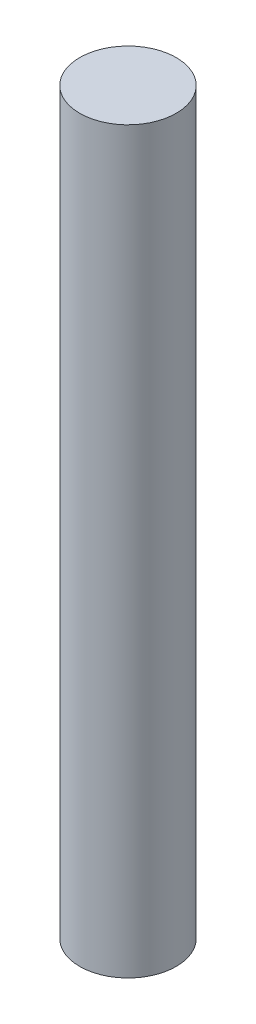
ISO-10303-21;
HEADER;
FILE_DESCRIPTION(('STEP AP214'),'2;1');
FILE_NAME('part.step','',(''),(''),'','','');
FILE_SCHEMA(('AUTOMOTIVE_DESIGN { 1 0 10303 214 1 1 1 1 }'));
ENDSEC;
DATA;
#1=APPLICATION_CONTEXT('core data for automotive mechanical design processes');
#2=APPLICATION_PROTOCOL_DEFINITION('international standard','automotive_design',2000,#1);
#3=PRODUCT_CONTEXT('',#1,'mechanical');
#4=PRODUCT('Part','Part','',(#3));
#5=PRODUCT_RELATED_PRODUCT_CATEGORY('part','',(#4));
#6=PRODUCT_DEFINITION_FORMATION('','',#4);
#7=PRODUCT_DEFINITION_CONTEXT('part definition',#1,'design');
#8=PRODUCT_DEFINITION('design','',#6,#7);
#9=PRODUCT_DEFINITION_SHAPE('','',#8);
#10=(LENGTH_UNIT() NAMED_UNIT(*) SI_UNIT(.MILLI.,.METRE.));
#11=(NAMED_UNIT(*) PLANE_ANGLE_UNIT() SI_UNIT($,.RADIAN.));
#12=(NAMED_UNIT(*) SI_UNIT($,.STERADIAN.) SOLID_ANGLE_UNIT());
#13=UNCERTAINTY_MEASURE_WITH_UNIT(LENGTH_MEASURE(1.E-05),#10,'distance_accuracy_value','');
#14=(GEOMETRIC_REPRESENTATION_CONTEXT(3) GLOBAL_UNCERTAINTY_ASSIGNED_CONTEXT((#13)) GLOBAL_UNIT_ASSIGNED_CONTEXT((#10,
#11,#12)) REPRESENTATION_CONTEXT('',''));
#15=CARTESIAN_POINT('',(0.,0.,0.));
#16=DIRECTION('',(0.,0.,1.));
#17=DIRECTION('',(1.,0.,0.));
#18=AXIS2_PLACEMENT_3D('',#15,#16,#17);
#19=CARTESIAN_POINT('',(0.,75.,0.));
#20=DIRECTION('',(0.,-1.,0.));
#21=DIRECTION('',(0.,0.,-1.));
#22=AXIS2_PLACEMENT_3D('',#19,#20,#21);
#23=CYLINDRICAL_SURFACE('',#22,4.9);
#24=CARTESIAN_POINT('',(0.,75.,0.));
#25=DIRECTION('',(0.,1.,0.));
#26=DIRECTION('',(0.,0.,1.));
#27=AXIS2_PLACEMENT_3D('',#24,#25,#26);
#28=CIRCLE('',#27,4.9);
#29=CARTESIAN_POINT('',(0.,75.,4.9));
#30=VERTEX_POINT('',#29);
#31=EDGE_CURVE('E10',#30,#30,#28,.T.);
#32=ORIENTED_EDGE('',*,*,#31,.F.);
#33=EDGE_LOOP('',(#32));
#34=FACE_BOUND('',#33,.T.);
#35=CARTESIAN_POINT('',(0.,0.,0.));
#36=DIRECTION('',(0.,1.,0.));
#37=DIRECTION('',(0.,0.,1.));
#38=AXIS2_PLACEMENT_3D('',#35,#36,#37);
#39=CIRCLE('',#38,4.9);
#40=CARTESIAN_POINT('',(0.,0.,4.9));
#41=VERTEX_POINT('',#40);
#42=EDGE_CURVE('E36',#41,#41,#39,.T.);
#43=ORIENTED_EDGE('',*,*,#42,.T.);
#44=EDGE_LOOP('',(#43));
#45=FACE_BOUND('',#44,.T.);
#46=ADVANCED_FACE('F33',(#34,#45),#23,.T.);
#47=CARTESIAN_POINT('',(0.,75.,0.));
#48=DIRECTION('',(0.,1.,0.));
#49=DIRECTION('',(0.,0.,1.));
#50=AXIS2_PLACEMENT_3D('',#47,#48,#49);
#51=PLANE('',#50);
#52=ORIENTED_EDGE('',*,*,#31,.T.);
#53=EDGE_LOOP('',(#52));
#54=FACE_BOUND('',#53,.T.);
#55=ADVANCED_FACE('F48',(#54),#51,.T.);
#56=CARTESIAN_POINT('',(0.,0.,0.));
#57=DIRECTION('',(0.,1.,0.));
#58=DIRECTION('',(0.,0.,1.));
#59=AXIS2_PLACEMENT_3D('',#56,#57,#58);
#60=PLANE('',#59);
#61=ORIENTED_EDGE('',*,*,#42,.F.);
#62=EDGE_LOOP('',(#61));
#63=FACE_BOUND('',#62,.T.);
#64=ADVANCED_FACE('F46',(#63),#60,.F.);
#65=CLOSED_SHELL('',(#46,#55,#64));
#66=MANIFOLD_SOLID_BREP('B2',#65);
#67=ADVANCED_BREP_SHAPE_REPRESENTATION('',(#18,#66),#14);
#68=SHAPE_DEFINITION_REPRESENTATION(#9,#67);
ENDSEC;
END-ISO-10303-21;
